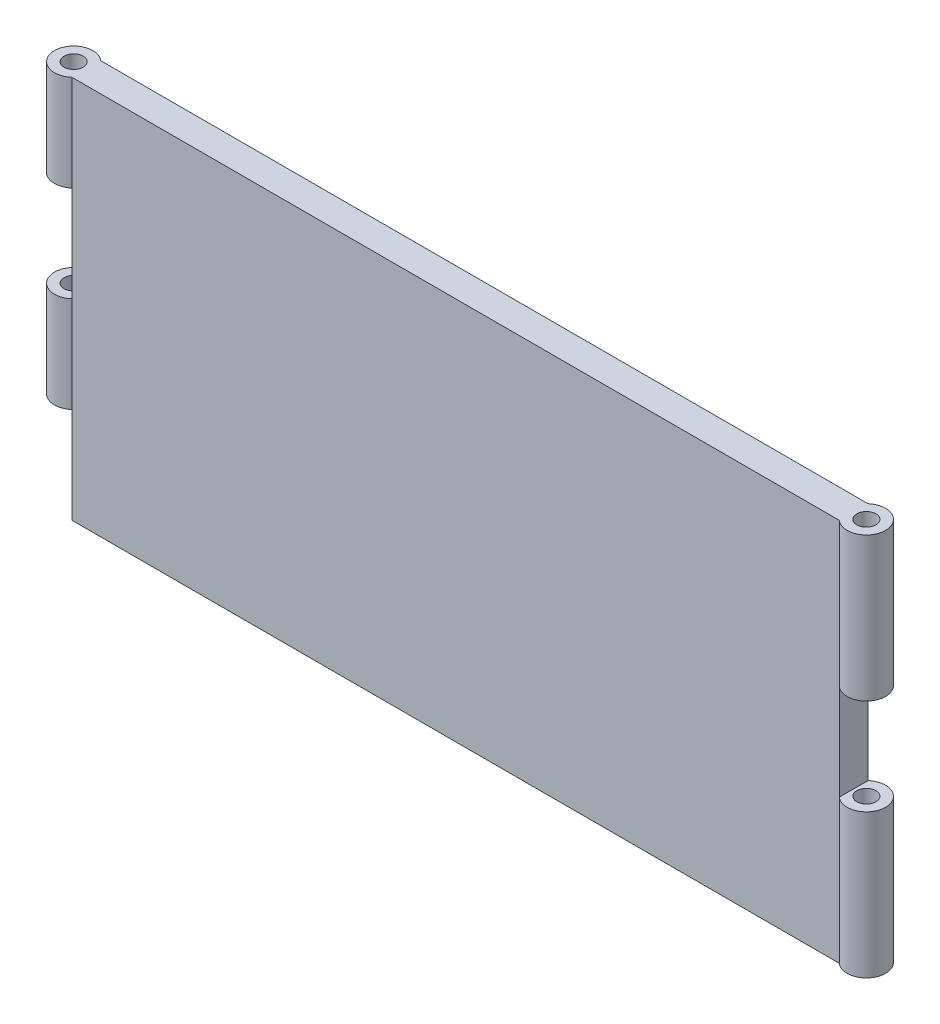
ISO-10303-21;
HEADER;
FILE_DESCRIPTION(('STEP AP214'),'2;1');
FILE_NAME('part.step','',(''),(''),'','','');
FILE_SCHEMA(('AUTOMOTIVE_DESIGN { 1 0 10303 214 1 1 1 1 }'));
ENDSEC;
DATA;
#1=APPLICATION_CONTEXT('core data for automotive mechanical design processes');
#2=APPLICATION_PROTOCOL_DEFINITION('international standard','automotive_design',2000,#1);
#3=PRODUCT_CONTEXT('',#1,'mechanical');
#4=PRODUCT('Part','Part','',(#3));
#5=PRODUCT_RELATED_PRODUCT_CATEGORY('part','',(#4));
#6=PRODUCT_DEFINITION_FORMATION('','',#4);
#7=PRODUCT_DEFINITION_CONTEXT('part definition',#1,'design');
#8=PRODUCT_DEFINITION('design','',#6,#7);
#9=PRODUCT_DEFINITION_SHAPE('','',#8);
#10=(LENGTH_UNIT() NAMED_UNIT(*) SI_UNIT(.MILLI.,.METRE.));
#11=(NAMED_UNIT(*) PLANE_ANGLE_UNIT() SI_UNIT($,.RADIAN.));
#12=(NAMED_UNIT(*) SI_UNIT($,.STERADIAN.) SOLID_ANGLE_UNIT());
#13=UNCERTAINTY_MEASURE_WITH_UNIT(LENGTH_MEASURE(1.E-05),#10,'distance_accuracy_value','');
#14=(GEOMETRIC_REPRESENTATION_CONTEXT(3) GLOBAL_UNCERTAINTY_ASSIGNED_CONTEXT((#13)) GLOBAL_UNIT_ASSIGNED_CONTEXT((#10,
#11,#12)) REPRESENTATION_CONTEXT('',''));
#15=CARTESIAN_POINT('',(0.,0.,0.));
#16=DIRECTION('',(0.,0.,1.));
#17=DIRECTION('',(1.,0.,0.));
#18=AXIS2_PLACEMENT_3D('',#15,#16,#17);
#19=CARTESIAN_POINT('',(40.,20.,3.));
#20=DIRECTION('',(-1.,0.,0.));
#21=DIRECTION('',(0.,0.,1.));
#22=AXIS2_PLACEMENT_3D('',#19,#20,#21);
#23=PLANE('',#22);
#24=DIRECTION('',(0.,1.,0.));
#25=VECTOR('',#24,1.);
#26=CARTESIAN_POINT('',(40.,20.,3.));
#27=LINE('',#26,#25);
#28=CARTESIAN_POINT('',(40.,-5.,3.));
#29=VERTEX_POINT('',#28);
#30=CARTESIAN_POINT('',(40.,5.,3.));
#31=VERTEX_POINT('',#30);
#32=EDGE_CURVE('E60',#29,#31,#27,.T.);
#33=ORIENTED_EDGE('',*,*,#32,.F.);
#34=DIRECTION('',(0.,0.,-1.));
#35=VECTOR('',#34,1.);
#36=CARTESIAN_POINT('',(40.,-5.,3.));
#37=LINE('',#36,#35);
#38=CARTESIAN_POINT('',(40.,-5.,0.));
#39=VERTEX_POINT('',#38);
#40=EDGE_CURVE('E125',#29,#39,#37,.T.);
#41=ORIENTED_EDGE('',*,*,#40,.T.);
#42=DIRECTION('',(0.,1.,0.));
#43=VECTOR('',#42,1.);
#44=CARTESIAN_POINT('',(40.,20.,0.));
#45=LINE('',#44,#43);
#46=CARTESIAN_POINT('',(40.,5.,0.));
#47=VERTEX_POINT('',#46);
#48=EDGE_CURVE('E114',#39,#47,#45,.T.);
#49=ORIENTED_EDGE('',*,*,#48,.T.);
#50=DIRECTION('',(0.,0.,-1.));
#51=VECTOR('',#50,1.);
#52=CARTESIAN_POINT('',(40.,5.,3.));
#53=LINE('',#52,#51);
#54=EDGE_CURVE('E156',#31,#47,#53,.T.);
#55=ORIENTED_EDGE('',*,*,#54,.F.);
#56=EDGE_LOOP('',(#33,#41,#49,#55));
#57=FACE_BOUND('',#56,.T.);
#58=ADVANCED_FACE('F46',(#57),#23,.F.);
#59=CARTESIAN_POINT('',(-40.,20.,3.));
#60=DIRECTION('',(1.,0.,0.));
#61=DIRECTION('',(0.,0.,-1.));
#62=AXIS2_PLACEMENT_3D('',#59,#60,#61);
#63=PLANE('',#62);
#64=DIRECTION('',(0.,0.,1.));
#65=VECTOR('',#64,1.);
#66=CARTESIAN_POINT('',(-40.,-9.99999999999999,3.));
#67=LINE('',#66,#65);
#68=CARTESIAN_POINT('',(-40.,-10.,0.));
#69=VERTEX_POINT('',#68);
#70=CARTESIAN_POINT('',(-40.,-9.99999999999999,3.));
#71=VERTEX_POINT('',#70);
#72=EDGE_CURVE('E177',#69,#71,#67,.T.);
#73=ORIENTED_EDGE('',*,*,#72,.F.);
#74=DIRECTION('',(0.,-1.,0.));
#75=VECTOR('',#74,1.);
#76=CARTESIAN_POINT('',(-40.,20.,0.));
#77=LINE('',#76,#75);
#78=CARTESIAN_POINT('',(-40.,-20.,0.));
#79=VERTEX_POINT('',#78);
#80=EDGE_CURVE('E209',#69,#79,#77,.T.);
#81=ORIENTED_EDGE('',*,*,#80,.T.);
#82=DIRECTION('',(0.,0.,-1.));
#83=VECTOR('',#82,1.);
#84=CARTESIAN_POINT('',(-40.,-20.,3.));
#85=LINE('',#84,#83);
#86=CARTESIAN_POINT('',(-40.,-20.,3.));
#87=VERTEX_POINT('',#86);
#88=EDGE_CURVE('E12',#87,#79,#85,.T.);
#89=ORIENTED_EDGE('',*,*,#88,.F.);
#90=DIRECTION('',(0.,-1.,0.));
#91=VECTOR('',#90,1.);
#92=CARTESIAN_POINT('',(-40.,20.,3.));
#93=LINE('',#92,#91);
#94=EDGE_CURVE('E202',#71,#87,#93,.T.);
#95=ORIENTED_EDGE('',*,*,#94,.F.);
#96=EDGE_LOOP('',(#73,#81,#89,#95));
#97=FACE_BOUND('',#96,.T.);
#98=ADVANCED_FACE('F224',(#97),#63,.F.);
#99=CARTESIAN_POINT('',(-40.,10.,0.));
#100=VERTEX_POINT('',#99);
#101=CARTESIAN_POINT('',(-40.,0.,0.));
#102=VERTEX_POINT('',#101);
#103=EDGE_CURVE('E213',#100,#102,#77,.T.);
#104=ORIENTED_EDGE('',*,*,#103,.T.);
#105=DIRECTION('',(0.,0.,1.));
#106=VECTOR('',#105,1.);
#107=CARTESIAN_POINT('',(-40.,0.,3.));
#108=LINE('',#107,#106);
#109=CARTESIAN_POINT('',(-40.,0.,3.));
#110=VERTEX_POINT('',#109);
#111=EDGE_CURVE('E173',#102,#110,#108,.T.);
#112=ORIENTED_EDGE('',*,*,#111,.T.);
#113=CARTESIAN_POINT('',(-40.,10.,3.));
#114=VERTEX_POINT('',#113);
#115=EDGE_CURVE('E206',#114,#110,#93,.T.);
#116=ORIENTED_EDGE('',*,*,#115,.F.);
#117=DIRECTION('',(0.,0.,1.));
#118=VECTOR('',#117,1.);
#119=CARTESIAN_POINT('',(-40.,10.,3.));
#120=LINE('',#119,#118);
#121=EDGE_CURVE('E193',#100,#114,#120,.T.);
#122=ORIENTED_EDGE('',*,*,#121,.F.);
#123=EDGE_LOOP('',(#104,#112,#116,#122));
#124=FACE_BOUND('',#123,.T.);
#125=ADVANCED_FACE('F251',(#124),#63,.F.);
#126=CARTESIAN_POINT('',(-40.,20.,3.));
#127=DIRECTION('',(0.,-1.,0.));
#128=DIRECTION('',(0.,0.,-1.));
#129=AXIS2_PLACEMENT_3D('',#126,#127,#128);
#130=PLANE('',#129);
#131=DIRECTION('',(-1.,0.,0.));
#132=VECTOR('',#131,1.);
#133=CARTESIAN_POINT('',(-40.,20.,3.));
#134=LINE('',#133,#132);
#135=CARTESIAN_POINT('',(40.,20.,3.));
#136=VERTEX_POINT('',#135);
#137=CARTESIAN_POINT('',(-40.,20.,3.));
#138=VERTEX_POINT('',#137);
#139=EDGE_CURVE('E200',#136,#138,#134,.T.);
#140=ORIENTED_EDGE('',*,*,#139,.F.);
#141=CARTESIAN_POINT('',(41.3228756555323,20.,1.5));
#142=DIRECTION('',(0.,1.,0.));
#143=DIRECTION('',(0.,0.,1.));
#144=AXIS2_PLACEMENT_3D('',#141,#142,#143);
#145=CIRCLE('',#144,2.);
#146=CARTESIAN_POINT('',(40.,20.,0.));
#147=VERTEX_POINT('',#146);
#148=EDGE_CURVE('E150',#136,#147,#145,.T.);
#149=ORIENTED_EDGE('',*,*,#148,.T.);
#150=DIRECTION('',(-1.,0.,0.));
#151=VECTOR('',#150,1.);
#152=CARTESIAN_POINT('',(-40.,20.,0.));
#153=LINE('',#152,#151);
#154=CARTESIAN_POINT('',(-40.,20.,0.));
#155=VERTEX_POINT('',#154);
#156=EDGE_CURVE('E137',#147,#155,#153,.T.);
#157=ORIENTED_EDGE('',*,*,#156,.T.);
#158=CARTESIAN_POINT('',(-41.3228756555323,20.,1.5));
#159=DIRECTION('',(0.,1.,0.));
#160=DIRECTION('',(0.,0.,1.));
#161=AXIS2_PLACEMENT_3D('',#158,#159,#160);
#162=CIRCLE('',#161,2.);
#163=EDGE_CURVE('E187',#155,#138,#162,.T.);
#164=ORIENTED_EDGE('',*,*,#163,.T.);
#165=EDGE_LOOP('',(#140,#149,#157,#164));
#166=FACE_BOUND('',#165,.T.);
#167=CARTESIAN_POINT('',(-41.3228756555323,20.,1.5));
#168=DIRECTION('',(0.,1.,0.));
#169=DIRECTION('',(0.,0.,1.));
#170=AXIS2_PLACEMENT_3D('',#167,#168,#169);
#171=CIRCLE('',#170,0.999999999999998);
#172=CARTESIAN_POINT('',(-41.3228756555323,20.,2.5));
#173=VERTEX_POINT('',#172);
#174=EDGE_CURVE('E183',#173,#173,#171,.T.);
#175=ORIENTED_EDGE('',*,*,#174,.F.);
#176=EDGE_LOOP('',(#175));
#177=FACE_BOUND('',#176,.T.);
#178=CARTESIAN_POINT('',(41.3228756555323,20.,1.5));
#179=DIRECTION('',(0.,1.,0.));
#180=DIRECTION('',(0.,0.,1.));
#181=AXIS2_PLACEMENT_3D('',#178,#179,#180);
#182=CIRCLE('',#181,0.999999999999998);
#183=CARTESIAN_POINT('',(41.3228756555323,20.,2.5));
#184=VERTEX_POINT('',#183);
#185=EDGE_CURVE('E129',#184,#184,#182,.T.);
#186=ORIENTED_EDGE('',*,*,#185,.F.);
#187=EDGE_LOOP('',(#186));
#188=FACE_BOUND('',#187,.T.);
#189=ADVANCED_FACE('F256',(#166,#177,#188),#130,.F.);
#190=CARTESIAN_POINT('',(-40.,-20.,3.));
#191=DIRECTION('',(0.,1.,0.));
#192=DIRECTION('',(0.,0.,1.));
#193=AXIS2_PLACEMENT_3D('',#190,#191,#192);
#194=PLANE('',#193);
#195=DIRECTION('',(1.,0.,0.));
#196=VECTOR('',#195,1.);
#197=CARTESIAN_POINT('',(-40.,-20.,0.));
#198=LINE('',#197,#196);
#199=CARTESIAN_POINT('',(40.,-20.,0.));
#200=VERTEX_POINT('',#199);
#201=EDGE_CURVE('E212',#79,#200,#198,.T.);
#202=ORIENTED_EDGE('',*,*,#201,.T.);
#203=CARTESIAN_POINT('',(41.3228756555323,-20.,1.5));
#204=DIRECTION('',(0.,1.,0.));
#205=DIRECTION('',(0.,0.,1.));
#206=AXIS2_PLACEMENT_3D('',#203,#204,#205);
#207=CIRCLE('',#206,2.);
#208=CARTESIAN_POINT('',(40.,-20.,3.));
#209=VERTEX_POINT('',#208);
#210=EDGE_CURVE('E130',#209,#200,#207,.T.);
#211=ORIENTED_EDGE('',*,*,#210,.F.);
#212=DIRECTION('',(1.,0.,0.));
#213=VECTOR('',#212,1.);
#214=CARTESIAN_POINT('',(-40.,-20.,3.));
#215=LINE('',#214,#213);
#216=EDGE_CURVE('E53',#87,#209,#215,.T.);
#217=ORIENTED_EDGE('',*,*,#216,.F.);
#218=ORIENTED_EDGE('',*,*,#88,.T.);
#219=EDGE_LOOP('',(#202,#211,#217,#218));
#220=FACE_BOUND('',#219,.T.);
#221=CARTESIAN_POINT('',(41.3228756555323,-20.,1.5));
#222=DIRECTION('',(0.,1.,0.));
#223=DIRECTION('',(0.,0.,1.));
#224=AXIS2_PLACEMENT_3D('',#221,#222,#223);
#225=CIRCLE('',#224,0.999999999999998);
#226=CARTESIAN_POINT('',(41.3228756555323,-20.,2.5));
#227=VERTEX_POINT('',#226);
#228=EDGE_CURVE('E139',#227,#227,#225,.T.);
#229=ORIENTED_EDGE('',*,*,#228,.T.);
#230=EDGE_LOOP('',(#229));
#231=FACE_BOUND('',#230,.T.);
#232=ADVANCED_FACE('F215',(#220,#231),#194,.F.);
#233=CARTESIAN_POINT('',(0.,0.,3.));
#234=DIRECTION('',(0.,0.,1.));
#235=DIRECTION('',(1.,0.,0.));
#236=AXIS2_PLACEMENT_3D('',#233,#234,#235);
#237=PLANE('',#236);
#238=EDGE_CURVE('E198',#209,#29,#27,.T.);
#239=ORIENTED_EDGE('',*,*,#238,.T.);
#240=ORIENTED_EDGE('',*,*,#32,.T.);
#241=DIRECTION('',(0.,1.,0.));
#242=VECTOR('',#241,1.);
#243=CARTESIAN_POINT('',(40.,5.,3.));
#244=LINE('',#243,#242);
#245=EDGE_CURVE('E160',#136,#31,#244,.F.);
#246=ORIENTED_EDGE('',*,*,#245,.F.);
#247=ORIENTED_EDGE('',*,*,#139,.T.);
#248=EDGE_CURVE('E203',#138,#114,#93,.T.);
#249=ORIENTED_EDGE('',*,*,#248,.T.);
#250=ORIENTED_EDGE('',*,*,#115,.T.);
#251=DIRECTION('',(0.,1.,0.));
#252=VECTOR('',#251,1.);
#253=CARTESIAN_POINT('',(-40.,-10.,3.));
#254=LINE('',#253,#252);
#255=EDGE_CURVE('E180',#71,#110,#254,.T.);
#256=ORIENTED_EDGE('',*,*,#255,.F.);
#257=ORIENTED_EDGE('',*,*,#94,.T.);
#258=ORIENTED_EDGE('',*,*,#216,.T.);
#259=EDGE_LOOP('',(#239,#240,#246,#247,#249,#250,#256,#257,#258));
#260=FACE_BOUND('',#259,.T.);
#261=ADVANCED_FACE('F265',(#260),#237,.T.);
#262=CARTESIAN_POINT('',(0.,0.,0.));
#263=DIRECTION('',(0.,0.,1.));
#264=DIRECTION('',(1.,0.,0.));
#265=AXIS2_PLACEMENT_3D('',#262,#263,#264);
#266=PLANE('',#265);
#267=EDGE_CURVE('E118',#200,#39,#45,.T.);
#268=ORIENTED_EDGE('',*,*,#267,.F.);
#269=ORIENTED_EDGE('',*,*,#201,.F.);
#270=ORIENTED_EDGE('',*,*,#80,.F.);
#271=EDGE_CURVE('E221',#102,#69,#77,.T.);
#272=ORIENTED_EDGE('',*,*,#271,.F.);
#273=ORIENTED_EDGE('',*,*,#103,.F.);
#274=EDGE_CURVE('E210',#155,#100,#77,.T.);
#275=ORIENTED_EDGE('',*,*,#274,.F.);
#276=ORIENTED_EDGE('',*,*,#156,.F.);
#277=EDGE_CURVE('E121',#47,#147,#45,.T.);
#278=ORIENTED_EDGE('',*,*,#277,.F.);
#279=ORIENTED_EDGE('',*,*,#48,.F.);
#280=EDGE_LOOP('',(#268,#269,#270,#272,#273,#275,#276,#278,#279));
#281=FACE_BOUND('',#280,.T.);
#282=ADVANCED_FACE('F115',(#281),#266,.F.);
#283=CARTESIAN_POINT('',(-41.3228756555323,10.,1.5));
#284=DIRECTION('',(0.,1.,0.));
#285=DIRECTION('',(0.,0.,1.));
#286=AXIS2_PLACEMENT_3D('',#283,#284,#285);
#287=PLANE('',#286);
#288=CARTESIAN_POINT('',(-41.3228756555323,10.,1.5));
#289=DIRECTION('',(0.,1.,0.));
#290=DIRECTION('',(0.,0.,1.));
#291=AXIS2_PLACEMENT_3D('',#288,#289,#290);
#292=CIRCLE('',#291,0.999999999999998);
#293=CARTESIAN_POINT('',(-41.3228756555323,10.,2.5));
#294=VERTEX_POINT('',#293);
#295=EDGE_CURVE('E184',#294,#294,#292,.T.);
#296=ORIENTED_EDGE('',*,*,#295,.T.);
#297=EDGE_LOOP('',(#296));
#298=FACE_BOUND('',#297,.T.);
#299=CARTESIAN_POINT('',(-41.3228756555323,10.,1.5));
#300=DIRECTION('',(0.,1.,0.));
#301=DIRECTION('',(0.,0.,1.));
#302=AXIS2_PLACEMENT_3D('',#299,#300,#301);
#303=CIRCLE('',#302,2.);
#304=EDGE_CURVE('E190',#100,#114,#303,.T.);
#305=ORIENTED_EDGE('',*,*,#304,.F.);
#306=ORIENTED_EDGE('',*,*,#121,.T.);
#307=EDGE_LOOP('',(#305,#306));
#308=FACE_BOUND('',#307,.T.);
#309=ADVANCED_FACE('F311',(#298,#308),#287,.F.);
#310=CARTESIAN_POINT('',(-41.3228756555323,10.,1.5));
#311=DIRECTION('',(0.,1.,0.));
#312=DIRECTION('',(0.,0.,1.));
#313=AXIS2_PLACEMENT_3D('',#310,#311,#312);
#314=CYLINDRICAL_SURFACE('',#313,2.);
#315=ORIENTED_EDGE('',*,*,#304,.T.);
#316=ORIENTED_EDGE('',*,*,#248,.F.);
#317=ORIENTED_EDGE('',*,*,#163,.F.);
#318=ORIENTED_EDGE('',*,*,#274,.T.);
#319=EDGE_LOOP('',(#315,#316,#317,#318));
#320=FACE_BOUND('',#319,.T.);
#321=ADVANCED_FACE('F243',(#320),#314,.T.);
#322=CARTESIAN_POINT('',(-41.3228756555323,10.,1.5));
#323=DIRECTION('',(0.,1.,0.));
#324=DIRECTION('',(0.,0.,1.));
#325=AXIS2_PLACEMENT_3D('',#322,#323,#324);
#326=CYLINDRICAL_SURFACE('',#325,0.999999999999998);
#327=ORIENTED_EDGE('',*,*,#295,.F.);
#328=EDGE_LOOP('',(#327));
#329=FACE_BOUND('',#328,.T.);
#330=ORIENTED_EDGE('',*,*,#174,.T.);
#331=EDGE_LOOP('',(#330));
#332=FACE_BOUND('',#331,.T.);
#333=ADVANCED_FACE('F234',(#329,#332),#326,.F.);
#334=CARTESIAN_POINT('',(-41.3228756555323,-10.,1.5));
#335=DIRECTION('',(0.,1.,0.));
#336=DIRECTION('',(0.,0.,1.));
#337=AXIS2_PLACEMENT_3D('',#334,#335,#336);
#338=PLANE('',#337);
#339=CARTESIAN_POINT('',(-41.3228756555323,-10.,1.5));
#340=DIRECTION('',(0.,1.,0.));
#341=DIRECTION('',(0.,0.,1.));
#342=AXIS2_PLACEMENT_3D('',#339,#340,#341);
#343=CIRCLE('',#342,0.999999999999998);
#344=CARTESIAN_POINT('',(-41.3228756555323,-10.,2.5));
#345=VERTEX_POINT('',#344);
#346=EDGE_CURVE('E164',#345,#345,#343,.T.);
#347=ORIENTED_EDGE('',*,*,#346,.T.);
#348=EDGE_LOOP('',(#347));
#349=FACE_BOUND('',#348,.T.);
#350=CARTESIAN_POINT('',(-41.3228756555323,-10.,1.5));
#351=DIRECTION('',(0.,1.,0.));
#352=DIRECTION('',(0.,0.,1.));
#353=AXIS2_PLACEMENT_3D('',#350,#351,#352);
#354=CIRCLE('',#353,2.);
#355=EDGE_CURVE('E170',#69,#71,#354,.T.);
#356=ORIENTED_EDGE('',*,*,#355,.F.);
#357=ORIENTED_EDGE('',*,*,#72,.T.);
#358=EDGE_LOOP('',(#356,#357));
#359=FACE_BOUND('',#358,.T.);
#360=ADVANCED_FACE('F231',(#349,#359),#338,.F.);
#361=CARTESIAN_POINT('',(-41.3228756555323,0.,1.5));
#362=DIRECTION('',(0.,1.,0.));
#363=DIRECTION('',(0.,0.,1.));
#364=AXIS2_PLACEMENT_3D('',#361,#362,#363);
#365=PLANE('',#364);
#366=CARTESIAN_POINT('',(-41.3228756555323,0.,1.5));
#367=DIRECTION('',(0.,1.,0.));
#368=DIRECTION('',(0.,0.,1.));
#369=AXIS2_PLACEMENT_3D('',#366,#367,#368);
#370=CIRCLE('',#369,0.999999999999998);
#371=CARTESIAN_POINT('',(-41.3228756555323,0.,2.5));
#372=VERTEX_POINT('',#371);
#373=EDGE_CURVE('E163',#372,#372,#370,.T.);
#374=ORIENTED_EDGE('',*,*,#373,.F.);
#375=EDGE_LOOP('',(#374));
#376=FACE_BOUND('',#375,.T.);
#377=ORIENTED_EDGE('',*,*,#111,.F.);
#378=CARTESIAN_POINT('',(-41.3228756555323,0.,1.5));
#379=DIRECTION('',(0.,1.,0.));
#380=DIRECTION('',(0.,0.,1.));
#381=AXIS2_PLACEMENT_3D('',#378,#379,#380);
#382=CIRCLE('',#381,2.);
#383=EDGE_CURVE('E167',#102,#110,#382,.T.);
#384=ORIENTED_EDGE('',*,*,#383,.T.);
#385=EDGE_LOOP('',(#377,#384));
#386=FACE_BOUND('',#385,.T.);
#387=ADVANCED_FACE('F233',(#376,#386),#365,.T.);
#388=CARTESIAN_POINT('',(-41.3228756555323,-10.,1.5));
#389=DIRECTION('',(0.,1.,0.));
#390=DIRECTION('',(0.,0.,1.));
#391=AXIS2_PLACEMENT_3D('',#388,#389,#390);
#392=CYLINDRICAL_SURFACE('',#391,2.);
#393=ORIENTED_EDGE('',*,*,#355,.T.);
#394=ORIENTED_EDGE('',*,*,#255,.T.);
#395=ORIENTED_EDGE('',*,*,#383,.F.);
#396=ORIENTED_EDGE('',*,*,#271,.T.);
#397=EDGE_LOOP('',(#393,#394,#395,#396));
#398=FACE_BOUND('',#397,.T.);
#399=ADVANCED_FACE('F230',(#398),#392,.T.);
#400=CARTESIAN_POINT('',(-41.3228756555323,-10.,1.5));
#401=DIRECTION('',(0.,1.,0.));
#402=DIRECTION('',(0.,0.,1.));
#403=AXIS2_PLACEMENT_3D('',#400,#401,#402);
#404=CYLINDRICAL_SURFACE('',#403,0.999999999999998);
#405=ORIENTED_EDGE('',*,*,#346,.F.);
#406=EDGE_LOOP('',(#405));
#407=FACE_BOUND('',#406,.T.);
#408=ORIENTED_EDGE('',*,*,#373,.T.);
#409=EDGE_LOOP('',(#408));
#410=FACE_BOUND('',#409,.T.);
#411=ADVANCED_FACE('F291',(#407,#410),#404,.F.);
#412=CARTESIAN_POINT('',(41.3228756555323,5.,1.5));
#413=DIRECTION('',(0.,1.,0.));
#414=DIRECTION('',(0.,0.,1.));
#415=AXIS2_PLACEMENT_3D('',#412,#413,#414);
#416=PLANE('',#415);
#417=CARTESIAN_POINT('',(41.3228756555323,5.,1.5));
#418=DIRECTION('',(0.,1.,0.));
#419=DIRECTION('',(0.,0.,1.));
#420=AXIS2_PLACEMENT_3D('',#417,#418,#419);
#421=CIRCLE('',#420,0.999999999999998);
#422=CARTESIAN_POINT('',(41.3228756555323,5.,2.5));
#423=VERTEX_POINT('',#422);
#424=EDGE_CURVE('E147',#423,#423,#421,.T.);
#425=ORIENTED_EDGE('',*,*,#424,.T.);
#426=EDGE_LOOP('',(#425));
#427=FACE_BOUND('',#426,.T.);
#428=CARTESIAN_POINT('',(41.3228756555323,5.,1.5));
#429=DIRECTION('',(0.,1.,0.));
#430=DIRECTION('',(0.,0.,1.));
#431=AXIS2_PLACEMENT_3D('',#428,#429,#430);
#432=CIRCLE('',#431,2.);
#433=EDGE_CURVE('E153',#31,#47,#432,.T.);
#434=ORIENTED_EDGE('',*,*,#433,.F.);
#435=ORIENTED_EDGE('',*,*,#54,.T.);
#436=EDGE_LOOP('',(#434,#435));
#437=FACE_BOUND('',#436,.T.);
#438=ADVANCED_FACE('F284',(#427,#437),#416,.F.);
#439=CARTESIAN_POINT('',(41.3228756555323,5.,1.5));
#440=DIRECTION('',(0.,1.,0.));
#441=DIRECTION('',(0.,0.,1.));
#442=AXIS2_PLACEMENT_3D('',#439,#440,#441);
#443=CYLINDRICAL_SURFACE('',#442,2.);
#444=ORIENTED_EDGE('',*,*,#148,.F.);
#445=ORIENTED_EDGE('',*,*,#245,.T.);
#446=ORIENTED_EDGE('',*,*,#433,.T.);
#447=ORIENTED_EDGE('',*,*,#277,.T.);
#448=EDGE_LOOP('',(#444,#445,#446,#447));
#449=FACE_BOUND('',#448,.T.);
#450=ADVANCED_FACE('F275',(#449),#443,.T.);
#451=CARTESIAN_POINT('',(41.3228756555323,5.,1.5));
#452=DIRECTION('',(0.,1.,0.));
#453=DIRECTION('',(0.,0.,1.));
#454=AXIS2_PLACEMENT_3D('',#451,#452,#453);
#455=CYLINDRICAL_SURFACE('',#454,0.999999999999998);
#456=ORIENTED_EDGE('',*,*,#424,.F.);
#457=EDGE_LOOP('',(#456));
#458=FACE_BOUND('',#457,.T.);
#459=ORIENTED_EDGE('',*,*,#185,.T.);
#460=EDGE_LOOP('',(#459));
#461=FACE_BOUND('',#460,.T.);
#462=ADVANCED_FACE('F273',(#458,#461),#455,.F.);
#463=CARTESIAN_POINT('',(41.3228756555323,-5.,1.5));
#464=DIRECTION('',(0.,1.,0.));
#465=DIRECTION('',(0.,0.,1.));
#466=AXIS2_PLACEMENT_3D('',#463,#464,#465);
#467=PLANE('',#466);
#468=CARTESIAN_POINT('',(41.3228756555323,-5.,1.5));
#469=DIRECTION('',(0.,1.,0.));
#470=DIRECTION('',(0.,0.,1.));
#471=AXIS2_PLACEMENT_3D('',#468,#469,#470);
#472=CIRCLE('',#471,0.999999999999998);
#473=CARTESIAN_POINT('',(41.3228756555323,-5.,2.5));
#474=VERTEX_POINT('',#473);
#475=EDGE_CURVE('E143',#474,#474,#472,.T.);
#476=ORIENTED_EDGE('',*,*,#475,.F.);
#477=EDGE_LOOP('',(#476));
#478=FACE_BOUND('',#477,.T.);
#479=ORIENTED_EDGE('',*,*,#40,.F.);
#480=CARTESIAN_POINT('',(41.3228756555323,-5.,1.5));
#481=DIRECTION('',(0.,1.,0.));
#482=DIRECTION('',(0.,0.,1.));
#483=AXIS2_PLACEMENT_3D('',#480,#481,#482);
#484=CIRCLE('',#483,2.);
#485=EDGE_CURVE('E135',#29,#39,#484,.T.);
#486=ORIENTED_EDGE('',*,*,#485,.T.);
#487=EDGE_LOOP('',(#479,#486));
#488=FACE_BOUND('',#487,.T.);
#489=ADVANCED_FACE('F138',(#478,#488),#467,.T.);
#490=CARTESIAN_POINT('',(41.3228756555323,-20.,1.5));
#491=DIRECTION('',(0.,1.,0.));
#492=DIRECTION('',(0.,0.,1.));
#493=AXIS2_PLACEMENT_3D('',#490,#491,#492);
#494=CYLINDRICAL_SURFACE('',#493,2.);
#495=ORIENTED_EDGE('',*,*,#485,.F.);
#496=ORIENTED_EDGE('',*,*,#238,.F.);
#497=ORIENTED_EDGE('',*,*,#210,.T.);
#498=ORIENTED_EDGE('',*,*,#267,.T.);
#499=EDGE_LOOP('',(#495,#496,#497,#498));
#500=FACE_BOUND('',#499,.T.);
#501=ADVANCED_FACE('F133',(#500),#494,.T.);
#502=CARTESIAN_POINT('',(41.3228756555323,-20.,1.5));
#503=DIRECTION('',(0.,1.,0.));
#504=DIRECTION('',(0.,0.,1.));
#505=AXIS2_PLACEMENT_3D('',#502,#503,#504);
#506=CYLINDRICAL_SURFACE('',#505,0.999999999999998);
#507=ORIENTED_EDGE('',*,*,#228,.F.);
#508=EDGE_LOOP('',(#507));
#509=FACE_BOUND('',#508,.T.);
#510=ORIENTED_EDGE('',*,*,#475,.T.);
#511=EDGE_LOOP('',(#510));
#512=FACE_BOUND('',#511,.T.);
#513=ADVANCED_FACE('F440',(#509,#512),#506,.F.);
#514=CLOSED_SHELL('',(#58,#98,#125,#189,#232,#261,#282,#309,#321,#333,#360,#387,#399,#411,#438,
#450,#462,#489,#501,#513));
#515=MANIFOLD_SOLID_BREP('B2',#514);
#516=ADVANCED_BREP_SHAPE_REPRESENTATION('',(#18,#515),#14);
#517=SHAPE_DEFINITION_REPRESENTATION(#9,#516);
ENDSEC;
END-ISO-10303-21;
